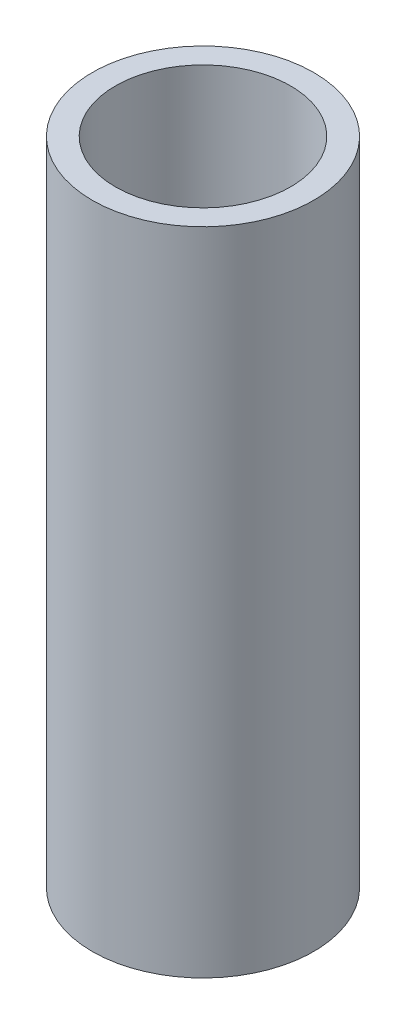
ISO-10303-21;
HEADER;
FILE_DESCRIPTION(('STEP AP214'),'2;1');
FILE_NAME('part.step','',(''),(''),'','','');
FILE_SCHEMA(('AUTOMOTIVE_DESIGN { 1 0 10303 214 1 1 1 1 }'));
ENDSEC;
DATA;
#1=APPLICATION_CONTEXT('core data for automotive mechanical design processes');
#2=APPLICATION_PROTOCOL_DEFINITION('international standard','automotive_design',2000,#1);
#3=PRODUCT_CONTEXT('',#1,'mechanical');
#4=PRODUCT('Part','Part','',(#3));
#5=PRODUCT_RELATED_PRODUCT_CATEGORY('part','',(#4));
#6=PRODUCT_DEFINITION_FORMATION('','',#4);
#7=PRODUCT_DEFINITION_CONTEXT('part definition',#1,'design');
#8=PRODUCT_DEFINITION('design','',#6,#7);
#9=PRODUCT_DEFINITION_SHAPE('','',#8);
#10=(LENGTH_UNIT() NAMED_UNIT(*) SI_UNIT(.MILLI.,.METRE.));
#11=(NAMED_UNIT(*) PLANE_ANGLE_UNIT() SI_UNIT($,.RADIAN.));
#12=(NAMED_UNIT(*) SI_UNIT($,.STERADIAN.) SOLID_ANGLE_UNIT());
#13=UNCERTAINTY_MEASURE_WITH_UNIT(LENGTH_MEASURE(1.E-05),#10,'distance_accuracy_value','');
#14=(GEOMETRIC_REPRESENTATION_CONTEXT(3) GLOBAL_UNCERTAINTY_ASSIGNED_CONTEXT((#13)) GLOBAL_UNIT_ASSIGNED_CONTEXT((#10,
#11,#12)) REPRESENTATION_CONTEXT('',''));
#15=CARTESIAN_POINT('',(0.,0.,0.));
#16=DIRECTION('',(0.,0.,1.));
#17=DIRECTION('',(1.,0.,0.));
#18=AXIS2_PLACEMENT_3D('',#15,#16,#17);
#19=CARTESIAN_POINT('',(0.,10.,0.));
#20=DIRECTION('',(0.,1.,0.));
#21=DIRECTION('',(0.,0.,1.));
#22=AXIS2_PLACEMENT_3D('',#19,#20,#21);
#23=PLANE('',#22);
#24=CARTESIAN_POINT('',(0.,10.,0.));
#25=DIRECTION('',(0.,1.,0.));
#26=DIRECTION('',(0.,0.,1.));
#27=AXIS2_PLACEMENT_3D('',#24,#25,#26);
#28=CIRCLE('',#27,1.702);
#29=CARTESIAN_POINT('',(0.,10.,1.702));
#30=VERTEX_POINT('',#29);
#31=EDGE_CURVE('E10',#30,#30,#28,.T.);
#32=ORIENTED_EDGE('',*,*,#31,.T.);
#33=EDGE_LOOP('',(#32));
#34=FACE_BOUND('',#33,.T.);
#35=CARTESIAN_POINT('',(0.,10.,0.));
#36=DIRECTION('',(0.,1.,0.));
#37=DIRECTION('',(0.,0.,1.));
#38=AXIS2_PLACEMENT_3D('',#35,#36,#37);
#39=CIRCLE('',#38,1.346);
#40=CARTESIAN_POINT('',(0.,10.,1.346));
#41=VERTEX_POINT('',#40);
#42=EDGE_CURVE('E42',#41,#41,#39,.T.);
#43=ORIENTED_EDGE('',*,*,#42,.F.);
#44=EDGE_LOOP('',(#43));
#45=FACE_BOUND('',#44,.T.);
#46=ADVANCED_FACE('F31',(#34,#45),#23,.T.);
#47=CARTESIAN_POINT('',(0.,0.,0.));
#48=DIRECTION('',(0.,1.,0.));
#49=DIRECTION('',(0.,0.,1.));
#50=AXIS2_PLACEMENT_3D('',#47,#48,#49);
#51=PLANE('',#50);
#52=CARTESIAN_POINT('',(0.,0.,0.));
#53=DIRECTION('',(0.,1.,0.));
#54=DIRECTION('',(0.,0.,1.));
#55=AXIS2_PLACEMENT_3D('',#52,#53,#54);
#56=CIRCLE('',#55,1.702);
#57=CARTESIAN_POINT('',(0.,0.,1.702));
#58=VERTEX_POINT('',#57);
#59=EDGE_CURVE('E35',#58,#58,#56,.T.);
#60=ORIENTED_EDGE('',*,*,#59,.F.);
#61=EDGE_LOOP('',(#60));
#62=FACE_BOUND('',#61,.T.);
#63=CARTESIAN_POINT('',(0.,0.,0.));
#64=DIRECTION('',(0.,1.,0.));
#65=DIRECTION('',(0.,0.,1.));
#66=AXIS2_PLACEMENT_3D('',#63,#64,#65);
#67=CIRCLE('',#66,1.346);
#68=CARTESIAN_POINT('',(0.,0.,1.346));
#69=VERTEX_POINT('',#68);
#70=EDGE_CURVE('E44',#69,#69,#67,.T.);
#71=ORIENTED_EDGE('',*,*,#70,.T.);
#72=EDGE_LOOP('',(#71));
#73=FACE_BOUND('',#72,.T.);
#74=ADVANCED_FACE('F54',(#62,#73),#51,.F.);
#75=CARTESIAN_POINT('',(0.,10.,0.));
#76=DIRECTION('',(0.,-1.,0.));
#77=DIRECTION('',(0.,0.,-1.));
#78=AXIS2_PLACEMENT_3D('',#75,#76,#77);
#79=CYLINDRICAL_SURFACE('',#78,1.702);
#80=ORIENTED_EDGE('',*,*,#31,.F.);
#81=EDGE_LOOP('',(#80));
#82=FACE_BOUND('',#81,.T.);
#83=ORIENTED_EDGE('',*,*,#59,.T.);
#84=EDGE_LOOP('',(#83));
#85=FACE_BOUND('',#84,.T.);
#86=ADVANCED_FACE('F33',(#82,#85),#79,.T.);
#87=CARTESIAN_POINT('',(0.,10.,0.));
#88=DIRECTION('',(0.,-1.,0.));
#89=DIRECTION('',(0.,0.,-1.));
#90=AXIS2_PLACEMENT_3D('',#87,#88,#89);
#91=CYLINDRICAL_SURFACE('',#90,1.346);
#92=ORIENTED_EDGE('',*,*,#42,.T.);
#93=EDGE_LOOP('',(#92));
#94=FACE_BOUND('',#93,.T.);
#95=ORIENTED_EDGE('',*,*,#70,.F.);
#96=EDGE_LOOP('',(#95));
#97=FACE_BOUND('',#96,.T.);
#98=ADVANCED_FACE('F50',(#94,#97),#91,.F.);
#99=CLOSED_SHELL('',(#46,#74,#86,#98));
#100=MANIFOLD_SOLID_BREP('B2',#99);
#101=ADVANCED_BREP_SHAPE_REPRESENTATION('',(#18,#100),#14);
#102=SHAPE_DEFINITION_REPRESENTATION(#9,#101);
ENDSEC;
END-ISO-10303-21;
